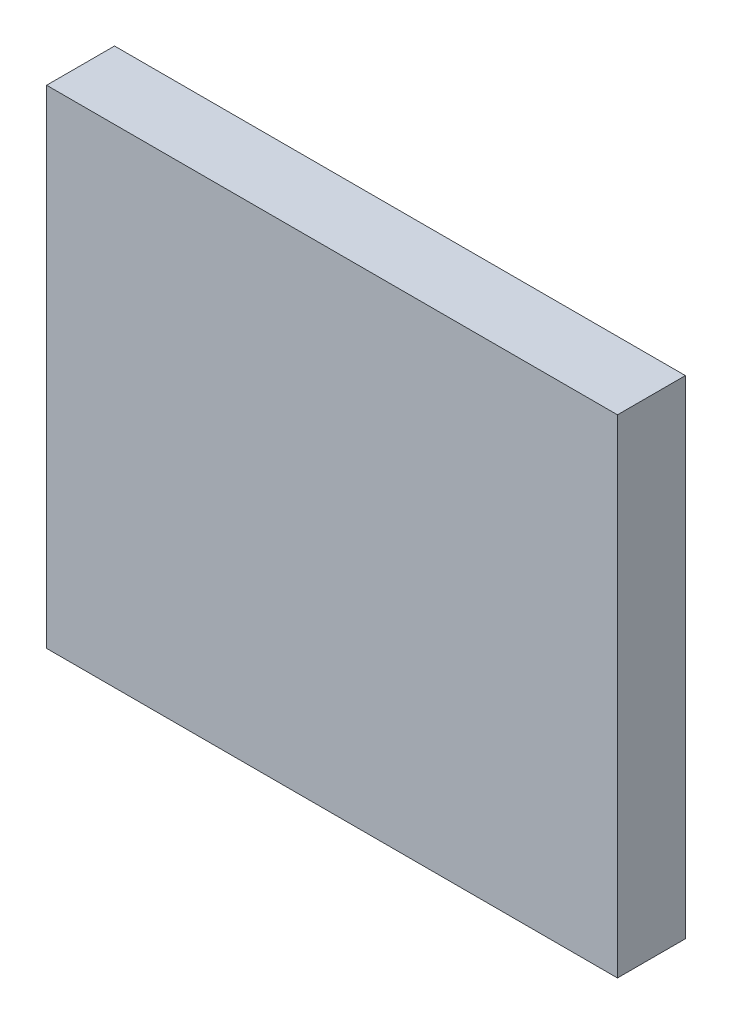
ISO-10303-21;
HEADER;
FILE_DESCRIPTION(('STEP AP214'),'2;1');
FILE_NAME('part.step','',(''),(''),'','','');
FILE_SCHEMA(('AUTOMOTIVE_DESIGN { 1 0 10303 214 1 1 1 1 }'));
ENDSEC;
DATA;
#1=APPLICATION_CONTEXT('core data for automotive mechanical design processes');
#2=APPLICATION_PROTOCOL_DEFINITION('international standard','automotive_design',2000,#1);
#3=PRODUCT_CONTEXT('',#1,'mechanical');
#4=PRODUCT('Part','Part','',(#3));
#5=PRODUCT_RELATED_PRODUCT_CATEGORY('part','',(#4));
#6=PRODUCT_DEFINITION_FORMATION('','',#4);
#7=PRODUCT_DEFINITION_CONTEXT('part definition',#1,'design');
#8=PRODUCT_DEFINITION('design','',#6,#7);
#9=PRODUCT_DEFINITION_SHAPE('','',#8);
#10=(LENGTH_UNIT() NAMED_UNIT(*) SI_UNIT(.MILLI.,.METRE.));
#11=(NAMED_UNIT(*) PLANE_ANGLE_UNIT() SI_UNIT($,.RADIAN.));
#12=(NAMED_UNIT(*) SI_UNIT($,.STERADIAN.) SOLID_ANGLE_UNIT());
#13=UNCERTAINTY_MEASURE_WITH_UNIT(LENGTH_MEASURE(1.E-05),#10,'distance_accuracy_value','');
#14=(GEOMETRIC_REPRESENTATION_CONTEXT(3) GLOBAL_UNCERTAINTY_ASSIGNED_CONTEXT((#13)) GLOBAL_UNIT_ASSIGNED_CONTEXT((#10,
#11,#12)) REPRESENTATION_CONTEXT('',''));
#15=CARTESIAN_POINT('',(0.,0.,0.));
#16=DIRECTION('',(0.,0.,1.));
#17=DIRECTION('',(1.,0.,0.));
#18=AXIS2_PLACEMENT_3D('',#15,#16,#17);
#19=CARTESIAN_POINT('',(-54.3545883946137,28.2717677394344,10.));
#20=DIRECTION('',(0.,1.,0.));
#21=DIRECTION('',(0.,0.,1.));
#22=AXIS2_PLACEMENT_3D('',#19,#20,#21);
#23=PLANE('',#22);
#24=DIRECTION('',(1.,0.,0.));
#25=VECTOR('',#24,1.);
#26=CARTESIAN_POINT('',(-54.3545883946137,28.2717677394344,0.));
#27=LINE('',#26,#25);
#28=CARTESIAN_POINT('',(-54.3545883946137,28.2717677394344,0.));
#29=VERTEX_POINT('',#28);
#30=CARTESIAN_POINT('',(29.6842829263344,28.2717677394344,0.));
#31=VERTEX_POINT('',#30);
#32=EDGE_CURVE('E98',#29,#31,#27,.T.);
#33=ORIENTED_EDGE('',*,*,#32,.F.);
#34=DIRECTION('',(0.,0.,-1.));
#35=VECTOR('',#34,1.);
#36=CARTESIAN_POINT('',(-54.3545883946137,28.2717677394344,10.));
#37=LINE('',#36,#35);
#38=CARTESIAN_POINT('',(-54.3545883946137,28.2717677394344,10.));
#39=VERTEX_POINT('',#38);
#40=EDGE_CURVE('E11',#39,#29,#37,.T.);
#41=ORIENTED_EDGE('',*,*,#40,.F.);
#42=DIRECTION('',(1.,0.,0.));
#43=VECTOR('',#42,1.);
#44=CARTESIAN_POINT('',(-54.3545883946137,28.2717677394344,10.));
#45=LINE('',#44,#43);
#46=CARTESIAN_POINT('',(29.6842829263344,28.2717677394344,10.));
#47=VERTEX_POINT('',#46);
#48=EDGE_CURVE('E93',#39,#47,#45,.T.);
#49=ORIENTED_EDGE('',*,*,#48,.T.);
#50=DIRECTION('',(0.,0.,-1.));
#51=VECTOR('',#50,1.);
#52=CARTESIAN_POINT('',(29.6842829263344,28.2717677394344,10.));
#53=LINE('',#52,#51);
#54=EDGE_CURVE('E36',#47,#31,#53,.T.);
#55=ORIENTED_EDGE('',*,*,#54,.T.);
#56=EDGE_LOOP('',(#33,#41,#49,#55));
#57=FACE_BOUND('',#56,.T.);
#58=ADVANCED_FACE('F33',(#57),#23,.T.);
#59=CARTESIAN_POINT('',(-54.3545883946137,28.2717677394344,10.));
#60=DIRECTION('',(1.,0.,0.));
#61=DIRECTION('',(0.,0.,-1.));
#62=AXIS2_PLACEMENT_3D('',#59,#60,#61);
#63=PLANE('',#62);
#64=DIRECTION('',(0.,-1.,0.));
#65=VECTOR('',#64,1.);
#66=CARTESIAN_POINT('',(-54.3545883946137,28.2717677394344,0.));
#67=LINE('',#66,#65);
#68=CARTESIAN_POINT('',(-54.3545883946137,-43.531559098004,0.));
#69=VERTEX_POINT('',#68);
#70=EDGE_CURVE('E66',#29,#69,#67,.T.);
#71=ORIENTED_EDGE('',*,*,#70,.T.);
#72=DIRECTION('',(0.,0.,-1.));
#73=VECTOR('',#72,1.);
#74=CARTESIAN_POINT('',(-54.3545883946137,-43.531559098004,10.));
#75=LINE('',#74,#73);
#76=CARTESIAN_POINT('',(-54.3545883946137,-43.531559098004,10.));
#77=VERTEX_POINT('',#76);
#78=EDGE_CURVE('E42',#77,#69,#75,.T.);
#79=ORIENTED_EDGE('',*,*,#78,.F.);
#80=DIRECTION('',(0.,-1.,0.));
#81=VECTOR('',#80,1.);
#82=CARTESIAN_POINT('',(-54.3545883946137,28.2717677394344,10.));
#83=LINE('',#82,#81);
#84=EDGE_CURVE('E83',#39,#77,#83,.T.);
#85=ORIENTED_EDGE('',*,*,#84,.F.);
#86=ORIENTED_EDGE('',*,*,#40,.T.);
#87=EDGE_LOOP('',(#71,#79,#85,#86));
#88=FACE_BOUND('',#87,.T.);
#89=ADVANCED_FACE('F108',(#88),#63,.F.);
#90=CARTESIAN_POINT('',(-54.3545883946137,-43.531559098004,10.));
#91=DIRECTION('',(0.,1.,0.));
#92=DIRECTION('',(0.,0.,1.));
#93=AXIS2_PLACEMENT_3D('',#90,#91,#92);
#94=PLANE('',#93);
#95=DIRECTION('',(1.,0.,0.));
#96=VECTOR('',#95,1.);
#97=CARTESIAN_POINT('',(-54.3545883946137,-43.531559098004,0.));
#98=LINE('',#97,#96);
#99=CARTESIAN_POINT('',(29.6842829263344,-43.531559098004,0.));
#100=VERTEX_POINT('',#99);
#101=EDGE_CURVE('E90',#69,#100,#98,.T.);
#102=ORIENTED_EDGE('',*,*,#101,.T.);
#103=DIRECTION('',(0.,0.,-1.));
#104=VECTOR('',#103,1.);
#105=CARTESIAN_POINT('',(29.6842829263344,-43.531559098004,10.));
#106=LINE('',#105,#104);
#107=CARTESIAN_POINT('',(29.6842829263344,-43.531559098004,10.));
#108=VERTEX_POINT('',#107);
#109=EDGE_CURVE('E87',#108,#100,#106,.T.);
#110=ORIENTED_EDGE('',*,*,#109,.F.);
#111=DIRECTION('',(1.,0.,0.));
#112=VECTOR('',#111,1.);
#113=CARTESIAN_POINT('',(-54.3545883946137,-43.531559098004,10.));
#114=LINE('',#113,#112);
#115=EDGE_CURVE('E78',#77,#108,#114,.T.);
#116=ORIENTED_EDGE('',*,*,#115,.F.);
#117=ORIENTED_EDGE('',*,*,#78,.T.);
#118=EDGE_LOOP('',(#102,#110,#116,#117));
#119=FACE_BOUND('',#118,.T.);
#120=ADVANCED_FACE('F88',(#119),#94,.F.);
#121=CARTESIAN_POINT('',(29.6842829263344,28.2717677394344,10.));
#122=DIRECTION('',(1.,0.,0.));
#123=DIRECTION('',(0.,1.,0.));
#124=AXIS2_PLACEMENT_3D('',#121,#122,#123);
#125=PLANE('',#124);
#126=DIRECTION('',(0.,-1.,0.));
#127=VECTOR('',#126,1.);
#128=CARTESIAN_POINT('',(29.6842829263344,28.2717677394344,0.));
#129=LINE('',#128,#127);
#130=EDGE_CURVE('E101',#31,#100,#129,.T.);
#131=ORIENTED_EDGE('',*,*,#130,.F.);
#132=ORIENTED_EDGE('',*,*,#54,.F.);
#133=DIRECTION('',(0.,-1.,0.));
#134=VECTOR('',#133,1.);
#135=CARTESIAN_POINT('',(29.6842829263344,28.2717677394344,10.));
#136=LINE('',#135,#134);
#137=EDGE_CURVE('E82',#47,#108,#136,.T.);
#138=ORIENTED_EDGE('',*,*,#137,.T.);
#139=ORIENTED_EDGE('',*,*,#109,.T.);
#140=EDGE_LOOP('',(#131,#132,#138,#139));
#141=FACE_BOUND('',#140,.T.);
#142=ADVANCED_FACE('F92',(#141),#125,.T.);
#143=CARTESIAN_POINT('',(0.,0.,10.));
#144=DIRECTION('',(0.,0.,-1.));
#145=DIRECTION('',(-1.,0.,0.));
#146=AXIS2_PLACEMENT_3D('',#143,#144,#145);
#147=PLANE('',#146);
#148=ORIENTED_EDGE('',*,*,#48,.F.);
#149=ORIENTED_EDGE('',*,*,#84,.T.);
#150=ORIENTED_EDGE('',*,*,#115,.T.);
#151=ORIENTED_EDGE('',*,*,#137,.F.);
#152=EDGE_LOOP('',(#148,#149,#150,#151));
#153=FACE_BOUND('',#152,.T.);
#154=ADVANCED_FACE('F81',(#153),#147,.F.);
#155=CARTESIAN_POINT('',(0.,0.,0.));
#156=DIRECTION('',(0.,0.,-1.));
#157=DIRECTION('',(-1.,0.,0.));
#158=AXIS2_PLACEMENT_3D('',#155,#156,#157);
#159=PLANE('',#158);
#160=ORIENTED_EDGE('',*,*,#32,.T.);
#161=ORIENTED_EDGE('',*,*,#130,.T.);
#162=ORIENTED_EDGE('',*,*,#101,.F.);
#163=ORIENTED_EDGE('',*,*,#70,.F.);
#164=EDGE_LOOP('',(#160,#161,#162,#163));
#165=FACE_BOUND('',#164,.T.);
#166=ADVANCED_FACE('F106',(#165),#159,.T.);
#167=CLOSED_SHELL('',(#58,#89,#120,#142,#154,#166));
#168=MANIFOLD_SOLID_BREP('B2',#167);
#169=ADVANCED_BREP_SHAPE_REPRESENTATION('',(#18,#168),#14);
#170=SHAPE_DEFINITION_REPRESENTATION(#9,#169);
ENDSEC;
END-ISO-10303-21;
